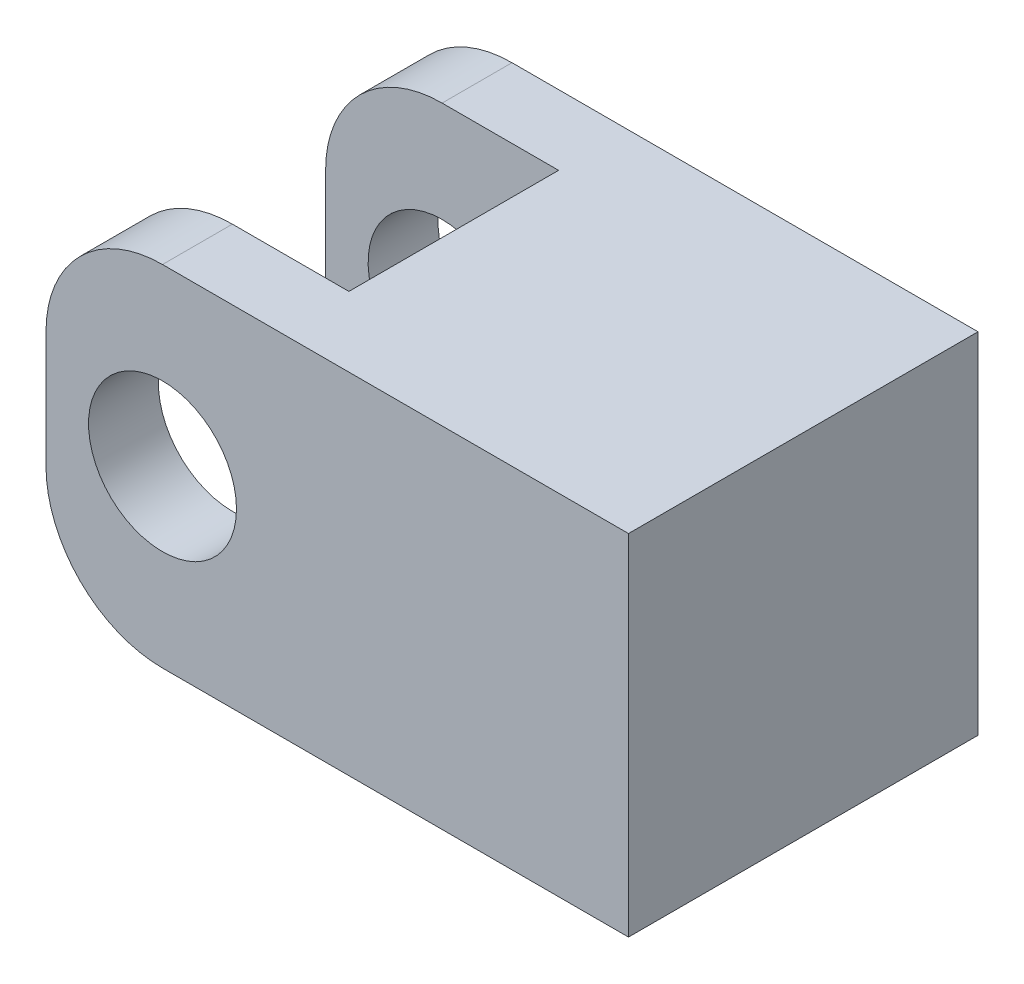
ISO-10303-21;
HEADER;
FILE_DESCRIPTION(('STEP AP214'),'2;1');
FILE_NAME('part.step','',(''),(''),'','','');
FILE_SCHEMA(('AUTOMOTIVE_DESIGN { 1 0 10303 214 1 1 1 1 }'));
ENDSEC;
DATA;
#1=APPLICATION_CONTEXT('core data for automotive mechanical design processes');
#2=APPLICATION_PROTOCOL_DEFINITION('international standard','automotive_design',2000,#1);
#3=PRODUCT_CONTEXT('',#1,'mechanical');
#4=PRODUCT('Part','Part','',(#3));
#5=PRODUCT_RELATED_PRODUCT_CATEGORY('part','',(#4));
#6=PRODUCT_DEFINITION_FORMATION('','',#4);
#7=PRODUCT_DEFINITION_CONTEXT('part definition',#1,'design');
#8=PRODUCT_DEFINITION('design','',#6,#7);
#9=PRODUCT_DEFINITION_SHAPE('','',#8);
#10=(LENGTH_UNIT() NAMED_UNIT(*) SI_UNIT(.MILLI.,.METRE.));
#11=(NAMED_UNIT(*) PLANE_ANGLE_UNIT() SI_UNIT($,.RADIAN.));
#12=(NAMED_UNIT(*) SI_UNIT($,.STERADIAN.) SOLID_ANGLE_UNIT());
#13=UNCERTAINTY_MEASURE_WITH_UNIT(LENGTH_MEASURE(1.E-05),#10,'distance_accuracy_value','');
#14=(GEOMETRIC_REPRESENTATION_CONTEXT(3) GLOBAL_UNCERTAINTY_ASSIGNED_CONTEXT((#13)) GLOBAL_UNIT_ASSIGNED_CONTEXT((#10,
#11,#12)) REPRESENTATION_CONTEXT('',''));
#15=CARTESIAN_POINT('',(0.,0.,0.));
#16=DIRECTION('',(0.,0.,1.));
#17=DIRECTION('',(1.,0.,0.));
#18=AXIS2_PLACEMENT_3D('',#15,#16,#17);
#19=CARTESIAN_POINT('',(-25.,15.,30.));
#20=DIRECTION('',(1.,0.,0.));
#21=DIRECTION('',(0.,1.,0.));
#22=AXIS2_PLACEMENT_3D('',#19,#20,#21);
#23=PLANE('',#22);
#24=DIRECTION('',(0.,0.,-1.));
#25=VECTOR('',#24,1.);
#26=CARTESIAN_POINT('',(-25.,-5.,30.));
#27=LINE('',#26,#25);
#28=CARTESIAN_POINT('',(-25.,-5.,0.));
#29=VERTEX_POINT('',#28);
#30=CARTESIAN_POINT('',(-25.,-5.,6.));
#31=VERTEX_POINT('',#30);
#32=EDGE_CURVE('E213',#29,#31,#27,.F.);
#33=ORIENTED_EDGE('',*,*,#32,.T.);
#34=DIRECTION('',(0.,-1.,0.));
#35=VECTOR('',#34,1.);
#36=CARTESIAN_POINT('',(-25.,15.,6.));
#37=LINE('',#36,#35);
#38=CARTESIAN_POINT('',(-25.,5.,6.));
#39=VERTEX_POINT('',#38);
#40=EDGE_CURVE('E151',#39,#31,#37,.T.);
#41=ORIENTED_EDGE('',*,*,#40,.F.);
#42=DIRECTION('',(0.,0.,-1.));
#43=VECTOR('',#42,1.);
#44=CARTESIAN_POINT('',(-25.,4.99999999999999,30.));
#45=LINE('',#44,#43);
#46=CARTESIAN_POINT('',(-25.,4.99999999999999,0.));
#47=VERTEX_POINT('',#46);
#48=EDGE_CURVE('E208',#39,#47,#45,.T.);
#49=ORIENTED_EDGE('',*,*,#48,.T.);
#50=DIRECTION('',(0.,-1.,0.));
#51=VECTOR('',#50,1.);
#52=CARTESIAN_POINT('',(-25.,15.,0.));
#53=LINE('',#52,#51);
#54=EDGE_CURVE('E192',#47,#29,#53,.T.);
#55=ORIENTED_EDGE('',*,*,#54,.T.);
#56=EDGE_LOOP('',(#33,#41,#49,#55));
#57=FACE_BOUND('',#56,.T.);
#58=ADVANCED_FACE('F33',(#57),#23,.F.);
#59=CARTESIAN_POINT('',(-15.,0.,-0.001000000000001));
#60=DIRECTION('',(0.,0.,1.));
#61=DIRECTION('',(1.,0.,0.));
#62=AXIS2_PLACEMENT_3D('',#59,#60,#61);
#63=CYLINDRICAL_SURFACE('',#62,6.35);
#64=CARTESIAN_POINT('',(-15.,0.,6.));
#65=DIRECTION('',(0.,0.,-1.));
#66=DIRECTION('',(0.,1.,0.));
#67=AXIS2_PLACEMENT_3D('',#64,#65,#66);
#68=CIRCLE('',#67,6.35);
#69=CARTESIAN_POINT('',(-15.,6.35,6.));
#70=VERTEX_POINT('',#69);
#71=EDGE_CURVE('E165',#70,#70,#68,.F.);
#72=ORIENTED_EDGE('',*,*,#71,.T.);
#73=EDGE_LOOP('',(#72));
#74=FACE_BOUND('',#73,.T.);
#75=CARTESIAN_POINT('',(-15.,0.,0.));
#76=DIRECTION('',(0.,0.,1.));
#77=DIRECTION('',(1.,0.,0.));
#78=AXIS2_PLACEMENT_3D('',#75,#76,#77);
#79=CIRCLE('',#78,6.35);
#80=CARTESIAN_POINT('',(-8.65,0.,0.));
#81=VERTEX_POINT('',#80);
#82=EDGE_CURVE('E171',#81,#81,#79,.F.);
#83=ORIENTED_EDGE('',*,*,#82,.T.);
#84=EDGE_LOOP('',(#83));
#85=FACE_BOUND('',#84,.T.);
#86=ADVANCED_FACE('F272',(#74,#85),#63,.F.);
#87=CARTESIAN_POINT('',(-15.,-5.,30.));
#88=DIRECTION('',(0.,0.,-1.));
#89=DIRECTION('',(-1.,0.,0.));
#90=AXIS2_PLACEMENT_3D('',#87,#88,#89);
#91=CYLINDRICAL_SURFACE('',#90,10.);
#92=CARTESIAN_POINT('',(-15.,-5.,6.));
#93=DIRECTION('',(0.,0.,-1.));
#94=DIRECTION('',(0.,1.,0.));
#95=AXIS2_PLACEMENT_3D('',#92,#93,#94);
#96=CIRCLE('',#95,10.);
#97=CARTESIAN_POINT('',(-15.,-15.,6.));
#98=VERTEX_POINT('',#97);
#99=EDGE_CURVE('E128',#31,#98,#96,.F.);
#100=ORIENTED_EDGE('',*,*,#99,.F.);
#101=ORIENTED_EDGE('',*,*,#32,.F.);
#102=CARTESIAN_POINT('',(-15.,-5.,0.));
#103=DIRECTION('',(0.,0.,1.));
#104=DIRECTION('',(1.,0.,0.));
#105=AXIS2_PLACEMENT_3D('',#102,#103,#104);
#106=CIRCLE('',#105,10.);
#107=CARTESIAN_POINT('',(-15.,-15.,0.));
#108=VERTEX_POINT('',#107);
#109=EDGE_CURVE('E206',#108,#29,#106,.F.);
#110=ORIENTED_EDGE('',*,*,#109,.F.);
#111=DIRECTION('',(0.,0.,-1.));
#112=VECTOR('',#111,1.);
#113=CARTESIAN_POINT('',(-15.,-15.,30.));
#114=LINE('',#113,#112);
#115=EDGE_CURVE('E201',#98,#108,#114,.T.);
#116=ORIENTED_EDGE('',*,*,#115,.F.);
#117=EDGE_LOOP('',(#100,#101,#110,#116));
#118=FACE_BOUND('',#117,.T.);
#119=ADVANCED_FACE('F260',(#118),#91,.T.);
#120=CARTESIAN_POINT('',(-15.,5.,30.));
#121=DIRECTION('',(0.,0.,-1.));
#122=DIRECTION('',(-1.,0.,0.));
#123=AXIS2_PLACEMENT_3D('',#120,#121,#122);
#124=CYLINDRICAL_SURFACE('',#123,10.);
#125=CARTESIAN_POINT('',(-15.,5.,6.));
#126=DIRECTION('',(0.,0.,-1.));
#127=DIRECTION('',(0.,1.,0.));
#128=AXIS2_PLACEMENT_3D('',#125,#126,#127);
#129=CIRCLE('',#128,10.);
#130=CARTESIAN_POINT('',(-15.,15.,6.));
#131=VERTEX_POINT('',#130);
#132=EDGE_CURVE('E11',#131,#39,#129,.F.);
#133=ORIENTED_EDGE('',*,*,#132,.F.);
#134=DIRECTION('',(0.,0.,-1.));
#135=VECTOR('',#134,1.);
#136=CARTESIAN_POINT('',(-15.,15.,30.));
#137=LINE('',#136,#135);
#138=CARTESIAN_POINT('',(-15.,15.,0.));
#139=VERTEX_POINT('',#138);
#140=EDGE_CURVE('E220',#139,#131,#137,.F.);
#141=ORIENTED_EDGE('',*,*,#140,.F.);
#142=CARTESIAN_POINT('',(-15.,5.,0.));
#143=DIRECTION('',(0.,0.,1.));
#144=DIRECTION('',(1.,0.,0.));
#145=AXIS2_PLACEMENT_3D('',#142,#143,#144);
#146=CIRCLE('',#145,10.);
#147=EDGE_CURVE('E204',#47,#139,#146,.F.);
#148=ORIENTED_EDGE('',*,*,#147,.F.);
#149=ORIENTED_EDGE('',*,*,#48,.F.);
#150=EDGE_LOOP('',(#133,#141,#148,#149));
#151=FACE_BOUND('',#150,.T.);
#152=ADVANCED_FACE('F252',(#151),#124,.T.);
#153=CARTESIAN_POINT('',(25.,15.,30.));
#154=DIRECTION('',(-1.,0.,0.));
#155=DIRECTION('',(0.,0.,1.));
#156=AXIS2_PLACEMENT_3D('',#153,#154,#155);
#157=PLANE('',#156);
#158=DIRECTION('',(0.,1.,0.));
#159=VECTOR('',#158,1.);
#160=CARTESIAN_POINT('',(25.,15.,0.));
#161=LINE('',#160,#159);
#162=CARTESIAN_POINT('',(25.,-15.,0.));
#163=VERTEX_POINT('',#162);
#164=CARTESIAN_POINT('',(25.,15.,0.));
#165=VERTEX_POINT('',#164);
#166=EDGE_CURVE('E174',#163,#165,#161,.T.);
#167=ORIENTED_EDGE('',*,*,#166,.T.);
#168=DIRECTION('',(0.,0.,-1.));
#169=VECTOR('',#168,1.);
#170=CARTESIAN_POINT('',(25.,15.,30.));
#171=LINE('',#170,#169);
#172=CARTESIAN_POINT('',(25.,15.,30.));
#173=VERTEX_POINT('',#172);
#174=EDGE_CURVE('E198',#173,#165,#171,.T.);
#175=ORIENTED_EDGE('',*,*,#174,.F.);
#176=DIRECTION('',(0.,1.,0.));
#177=VECTOR('',#176,1.);
#178=CARTESIAN_POINT('',(25.,15.,30.));
#179=LINE('',#178,#177);
#180=CARTESIAN_POINT('',(25.,-15.,30.));
#181=VERTEX_POINT('',#180);
#182=EDGE_CURVE('E175',#181,#173,#179,.T.);
#183=ORIENTED_EDGE('',*,*,#182,.F.);
#184=DIRECTION('',(0.,0.,-1.));
#185=VECTOR('',#184,1.);
#186=CARTESIAN_POINT('',(25.,-15.,30.));
#187=LINE('',#186,#185);
#188=EDGE_CURVE('E186',#181,#163,#187,.T.);
#189=ORIENTED_EDGE('',*,*,#188,.T.);
#190=EDGE_LOOP('',(#167,#175,#183,#189));
#191=FACE_BOUND('',#190,.T.);
#192=ADVANCED_FACE('F246',(#191),#157,.F.);
#193=CARTESIAN_POINT('',(-25.,15.,30.));
#194=DIRECTION('',(0.,-1.,0.));
#195=DIRECTION('',(0.,0.,-1.));
#196=AXIS2_PLACEMENT_3D('',#193,#194,#195);
#197=PLANE('',#196);
#198=ORIENTED_EDGE('',*,*,#140,.T.);
#199=DIRECTION('',(-1.,0.,0.));
#200=VECTOR('',#199,1.);
#201=CARTESIAN_POINT('',(-5.,15.,6.));
#202=LINE('',#201,#200);
#203=CARTESIAN_POINT('',(-5.,15.,6.));
#204=VERTEX_POINT('',#203);
#205=EDGE_CURVE('E154',#204,#131,#202,.T.);
#206=ORIENTED_EDGE('',*,*,#205,.F.);
#207=DIRECTION('',(0.,0.,-1.));
#208=VECTOR('',#207,1.);
#209=CARTESIAN_POINT('',(-5.,15.,6.));
#210=LINE('',#209,#208);
#211=CARTESIAN_POINT('',(-5.,15.,24.));
#212=VERTEX_POINT('',#211);
#213=EDGE_CURVE('E133',#212,#204,#210,.T.);
#214=ORIENTED_EDGE('',*,*,#213,.F.);
#215=DIRECTION('',(-1.,0.,0.));
#216=VECTOR('',#215,1.);
#217=CARTESIAN_POINT('',(-5.,15.,24.));
#218=LINE('',#217,#216);
#219=CARTESIAN_POINT('',(-15.,15.,24.));
#220=VERTEX_POINT('',#219);
#221=EDGE_CURVE('E157',#212,#220,#218,.T.);
#222=ORIENTED_EDGE('',*,*,#221,.T.);
#223=CARTESIAN_POINT('',(-15.,15.,30.));
#224=VERTEX_POINT('',#223);
#225=EDGE_CURVE('E56',#220,#224,#137,.F.);
#226=ORIENTED_EDGE('',*,*,#225,.T.);
#227=DIRECTION('',(-1.,0.,0.));
#228=VECTOR('',#227,1.);
#229=CARTESIAN_POINT('',(-25.,15.,30.));
#230=LINE('',#229,#228);
#231=EDGE_CURVE('E178',#173,#224,#230,.T.);
#232=ORIENTED_EDGE('',*,*,#231,.F.);
#233=ORIENTED_EDGE('',*,*,#174,.T.);
#234=DIRECTION('',(-1.,0.,0.));
#235=VECTOR('',#234,1.);
#236=CARTESIAN_POINT('',(-25.,15.,0.));
#237=LINE('',#236,#235);
#238=EDGE_CURVE('E189',#165,#139,#237,.T.);
#239=ORIENTED_EDGE('',*,*,#238,.T.);
#240=EDGE_LOOP('',(#198,#206,#214,#222,#226,#232,#233,#239));
#241=FACE_BOUND('',#240,.T.);
#242=ADVANCED_FACE('F226',(#241),#197,.F.);
#243=CARTESIAN_POINT('',(-25.,4.99999999999999,30.));
#244=VERTEX_POINT('',#243);
#245=CARTESIAN_POINT('',(-25.,4.99999999999999,24.));
#246=VERTEX_POINT('',#245);
#247=EDGE_CURVE('E209',#244,#246,#45,.T.);
#248=ORIENTED_EDGE('',*,*,#247,.T.);
#249=DIRECTION('',(0.,1.,0.));
#250=VECTOR('',#249,1.);
#251=CARTESIAN_POINT('',(-25.,15.,24.));
#252=LINE('',#251,#250);
#253=CARTESIAN_POINT('',(-25.,-5.,24.));
#254=VERTEX_POINT('',#253);
#255=EDGE_CURVE('E48',#254,#246,#252,.T.);
#256=ORIENTED_EDGE('',*,*,#255,.F.);
#257=CARTESIAN_POINT('',(-25.,-5.,30.));
#258=VERTEX_POINT('',#257);
#259=EDGE_CURVE('E212',#254,#258,#27,.F.);
#260=ORIENTED_EDGE('',*,*,#259,.T.);
#261=DIRECTION('',(0.,-1.,0.));
#262=VECTOR('',#261,1.);
#263=CARTESIAN_POINT('',(-25.,15.,30.));
#264=LINE('',#263,#262);
#265=EDGE_CURVE('E181',#244,#258,#264,.T.);
#266=ORIENTED_EDGE('',*,*,#265,.F.);
#267=EDGE_LOOP('',(#248,#256,#260,#266));
#268=FACE_BOUND('',#267,.T.);
#269=ADVANCED_FACE('F233',(#268),#23,.F.);
#270=CARTESIAN_POINT('',(-25.,-15.,30.));
#271=DIRECTION('',(0.,1.,0.));
#272=DIRECTION('',(0.,0.,1.));
#273=AXIS2_PLACEMENT_3D('',#270,#271,#272);
#274=PLANE('',#273);
#275=DIRECTION('',(0.,0.,1.));
#276=VECTOR('',#275,1.);
#277=CARTESIAN_POINT('',(-4.99999999999999,-15.,6.));
#278=LINE('',#277,#276);
#279=CARTESIAN_POINT('',(-4.99999999999999,-15.,6.));
#280=VERTEX_POINT('',#279);
#281=CARTESIAN_POINT('',(-4.99999999999999,-15.,24.));
#282=VERTEX_POINT('',#281);
#283=EDGE_CURVE('E139',#280,#282,#278,.T.);
#284=ORIENTED_EDGE('',*,*,#283,.F.);
#285=DIRECTION('',(-1.,0.,0.));
#286=VECTOR('',#285,1.);
#287=CARTESIAN_POINT('',(-4.99999999999999,-15.,6.));
#288=LINE('',#287,#286);
#289=EDGE_CURVE('E121',#280,#98,#288,.T.);
#290=ORIENTED_EDGE('',*,*,#289,.T.);
#291=ORIENTED_EDGE('',*,*,#115,.T.);
#292=DIRECTION('',(1.,0.,0.));
#293=VECTOR('',#292,1.);
#294=CARTESIAN_POINT('',(-25.,-15.,0.));
#295=LINE('',#294,#293);
#296=EDGE_CURVE('E179',#108,#163,#295,.T.);
#297=ORIENTED_EDGE('',*,*,#296,.T.);
#298=ORIENTED_EDGE('',*,*,#188,.F.);
#299=DIRECTION('',(1.,0.,0.));
#300=VECTOR('',#299,1.);
#301=CARTESIAN_POINT('',(-25.,-15.,30.));
#302=LINE('',#301,#300);
#303=CARTESIAN_POINT('',(-15.,-15.,30.));
#304=VERTEX_POINT('',#303);
#305=EDGE_CURVE('E184',#304,#181,#302,.T.);
#306=ORIENTED_EDGE('',*,*,#305,.F.);
#307=CARTESIAN_POINT('',(-15.,-15.,24.));
#308=VERTEX_POINT('',#307);
#309=EDGE_CURVE('E202',#304,#308,#114,.T.);
#310=ORIENTED_EDGE('',*,*,#309,.T.);
#311=DIRECTION('',(-1.,0.,0.));
#312=VECTOR('',#311,1.);
#313=CARTESIAN_POINT('',(-4.99999999999999,-15.,24.));
#314=LINE('',#313,#312);
#315=EDGE_CURVE('E132',#282,#308,#314,.T.);
#316=ORIENTED_EDGE('',*,*,#315,.F.);
#317=EDGE_LOOP('',(#284,#290,#291,#297,#298,#306,#310,#316));
#318=FACE_BOUND('',#317,.T.);
#319=ADVANCED_FACE('F144',(#318),#274,.F.);
#320=CARTESIAN_POINT('',(0.,0.,30.));
#321=DIRECTION('',(0.,0.,1.));
#322=DIRECTION('',(1.,0.,0.));
#323=AXIS2_PLACEMENT_3D('',#320,#321,#322);
#324=PLANE('',#323);
#325=CARTESIAN_POINT('',(-15.,0.,30.));
#326=DIRECTION('',(0.,0.,1.));
#327=DIRECTION('',(1.,0.,0.));
#328=AXIS2_PLACEMENT_3D('',#325,#326,#327);
#329=CIRCLE('',#328,6.35);
#330=CARTESIAN_POINT('',(-8.65,0.,30.));
#331=VERTEX_POINT('',#330);
#332=EDGE_CURVE('E168',#331,#331,#329,.T.);
#333=ORIENTED_EDGE('',*,*,#332,.F.);
#334=EDGE_LOOP('',(#333));
#335=FACE_BOUND('',#334,.T.);
#336=ORIENTED_EDGE('',*,*,#265,.T.);
#337=CARTESIAN_POINT('',(-15.,-5.,30.));
#338=DIRECTION('',(0.,0.,1.));
#339=DIRECTION('',(1.,0.,0.));
#340=AXIS2_PLACEMENT_3D('',#337,#338,#339);
#341=CIRCLE('',#340,10.);
#342=EDGE_CURVE('E218',#258,#304,#341,.T.);
#343=ORIENTED_EDGE('',*,*,#342,.T.);
#344=ORIENTED_EDGE('',*,*,#305,.T.);
#345=ORIENTED_EDGE('',*,*,#182,.T.);
#346=ORIENTED_EDGE('',*,*,#231,.T.);
#347=CARTESIAN_POINT('',(-15.,5.,30.));
#348=DIRECTION('',(0.,0.,1.));
#349=DIRECTION('',(1.,0.,0.));
#350=AXIS2_PLACEMENT_3D('',#347,#348,#349);
#351=CIRCLE('',#350,10.);
#352=EDGE_CURVE('E216',#224,#244,#351,.T.);
#353=ORIENTED_EDGE('',*,*,#352,.T.);
#354=EDGE_LOOP('',(#336,#343,#344,#345,#346,#353));
#355=FACE_BOUND('',#354,.T.);
#356=ADVANCED_FACE('F230',(#335,#355),#324,.T.);
#357=CARTESIAN_POINT('',(0.,0.,0.));
#358=DIRECTION('',(0.,0.,1.));
#359=DIRECTION('',(1.,0.,0.));
#360=AXIS2_PLACEMENT_3D('',#357,#358,#359);
#361=PLANE('',#360);
#362=ORIENTED_EDGE('',*,*,#82,.F.);
#363=EDGE_LOOP('',(#362));
#364=FACE_BOUND('',#363,.T.);
#365=ORIENTED_EDGE('',*,*,#296,.F.);
#366=ORIENTED_EDGE('',*,*,#109,.T.);
#367=ORIENTED_EDGE('',*,*,#54,.F.);
#368=ORIENTED_EDGE('',*,*,#147,.T.);
#369=ORIENTED_EDGE('',*,*,#238,.F.);
#370=ORIENTED_EDGE('',*,*,#166,.F.);
#371=EDGE_LOOP('',(#365,#366,#367,#368,#369,#370));
#372=FACE_BOUND('',#371,.T.);
#373=ADVANCED_FACE('F261',(#364,#372),#361,.F.);
#374=CARTESIAN_POINT('',(-15.,0.,24.));
#375=DIRECTION('',(0.,0.,1.));
#376=DIRECTION('',(0.,-1.,0.));
#377=AXIS2_PLACEMENT_3D('',#374,#375,#376);
#378=CIRCLE('',#377,6.35);
#379=CARTESIAN_POINT('',(-15.,-6.35,24.));
#380=VERTEX_POINT('',#379);
#381=EDGE_CURVE('E161',#380,#380,#378,.F.);
#382=ORIENTED_EDGE('',*,*,#381,.T.);
#383=EDGE_LOOP('',(#382));
#384=FACE_BOUND('',#383,.T.);
#385=ORIENTED_EDGE('',*,*,#332,.T.);
#386=EDGE_LOOP('',(#385));
#387=FACE_BOUND('',#386,.T.);
#388=ADVANCED_FACE('F263',(#384,#387),#63,.F.);
#389=CARTESIAN_POINT('',(-15.,-5.,24.));
#390=DIRECTION('',(0.,0.,1.));
#391=DIRECTION('',(0.,-1.,0.));
#392=AXIS2_PLACEMENT_3D('',#389,#390,#391);
#393=CIRCLE('',#392,10.);
#394=EDGE_CURVE('E156',#308,#254,#393,.F.);
#395=ORIENTED_EDGE('',*,*,#394,.F.);
#396=ORIENTED_EDGE('',*,*,#309,.F.);
#397=ORIENTED_EDGE('',*,*,#342,.F.);
#398=ORIENTED_EDGE('',*,*,#259,.F.);
#399=EDGE_LOOP('',(#395,#396,#397,#398));
#400=FACE_BOUND('',#399,.T.);
#401=ADVANCED_FACE('F237',(#400),#91,.T.);
#402=CARTESIAN_POINT('',(-15.,5.,24.));
#403=DIRECTION('',(0.,0.,1.));
#404=DIRECTION('',(0.,-1.,0.));
#405=AXIS2_PLACEMENT_3D('',#402,#403,#404);
#406=CIRCLE('',#405,10.);
#407=EDGE_CURVE('E41',#246,#220,#406,.F.);
#408=ORIENTED_EDGE('',*,*,#407,.F.);
#409=ORIENTED_EDGE('',*,*,#247,.F.);
#410=ORIENTED_EDGE('',*,*,#352,.F.);
#411=ORIENTED_EDGE('',*,*,#225,.F.);
#412=EDGE_LOOP('',(#408,#409,#410,#411));
#413=FACE_BOUND('',#412,.T.);
#414=ADVANCED_FACE('F35',(#413),#124,.T.);
#415=CARTESIAN_POINT('',(-5.,15.,6.));
#416=DIRECTION('',(0.,0.,-1.));
#417=DIRECTION('',(0.,1.,0.));
#418=AXIS2_PLACEMENT_3D('',#415,#416,#417);
#419=PLANE('',#418);
#420=ORIENTED_EDGE('',*,*,#99,.T.);
#421=ORIENTED_EDGE('',*,*,#289,.F.);
#422=DIRECTION('',(0.,-1.,0.));
#423=VECTOR('',#422,1.);
#424=CARTESIAN_POINT('',(-5.,15.,6.));
#425=LINE('',#424,#423);
#426=EDGE_CURVE('E125',#204,#280,#425,.T.);
#427=ORIENTED_EDGE('',*,*,#426,.F.);
#428=ORIENTED_EDGE('',*,*,#205,.T.);
#429=ORIENTED_EDGE('',*,*,#132,.T.);
#430=ORIENTED_EDGE('',*,*,#40,.T.);
#431=EDGE_LOOP('',(#420,#421,#427,#428,#429,#430));
#432=FACE_BOUND('',#431,.T.);
#433=ORIENTED_EDGE('',*,*,#71,.F.);
#434=EDGE_LOOP('',(#433));
#435=FACE_BOUND('',#434,.T.);
#436=ADVANCED_FACE('F123',(#432,#435),#419,.F.);
#437=CARTESIAN_POINT('',(-5.,15.,24.));
#438=DIRECTION('',(0.,0.,1.));
#439=DIRECTION('',(0.,-1.,0.));
#440=AXIS2_PLACEMENT_3D('',#437,#438,#439);
#441=PLANE('',#440);
#442=ORIENTED_EDGE('',*,*,#394,.T.);
#443=ORIENTED_EDGE('',*,*,#255,.T.);
#444=ORIENTED_EDGE('',*,*,#407,.T.);
#445=ORIENTED_EDGE('',*,*,#221,.F.);
#446=DIRECTION('',(0.,1.,0.));
#447=VECTOR('',#446,1.);
#448=CARTESIAN_POINT('',(-5.,15.,24.));
#449=LINE('',#448,#447);
#450=EDGE_CURVE('E146',#282,#212,#449,.T.);
#451=ORIENTED_EDGE('',*,*,#450,.F.);
#452=ORIENTED_EDGE('',*,*,#315,.T.);
#453=EDGE_LOOP('',(#442,#443,#444,#445,#451,#452));
#454=FACE_BOUND('',#453,.T.);
#455=ORIENTED_EDGE('',*,*,#381,.F.);
#456=EDGE_LOOP('',(#455));
#457=FACE_BOUND('',#456,.T.);
#458=ADVANCED_FACE('F222',(#454,#457),#441,.F.);
#459=CARTESIAN_POINT('',(-5.,0.,0.));
#460=DIRECTION('',(-1.,0.,0.));
#461=DIRECTION('',(0.,-1.,0.));
#462=AXIS2_PLACEMENT_3D('',#459,#460,#461);
#463=PLANE('',#462);
#464=ORIENTED_EDGE('',*,*,#426,.T.);
#465=ORIENTED_EDGE('',*,*,#283,.T.);
#466=ORIENTED_EDGE('',*,*,#450,.T.);
#467=ORIENTED_EDGE('',*,*,#213,.T.);
#468=EDGE_LOOP('',(#464,#465,#466,#467));
#469=FACE_BOUND('',#468,.T.);
#470=ADVANCED_FACE('F137',(#469),#463,.T.);
#471=CLOSED_SHELL('',(#58,#86,#119,#152,#192,#242,#269,#319,#356,#373,#388,#401,#414,#436,#458,#470));
#472=MANIFOLD_SOLID_BREP('B2',#471);
#473=ADVANCED_BREP_SHAPE_REPRESENTATION('',(#18,#472),#14);
#474=SHAPE_DEFINITION_REPRESENTATION(#9,#473);
ENDSEC;
END-ISO-10303-21;
